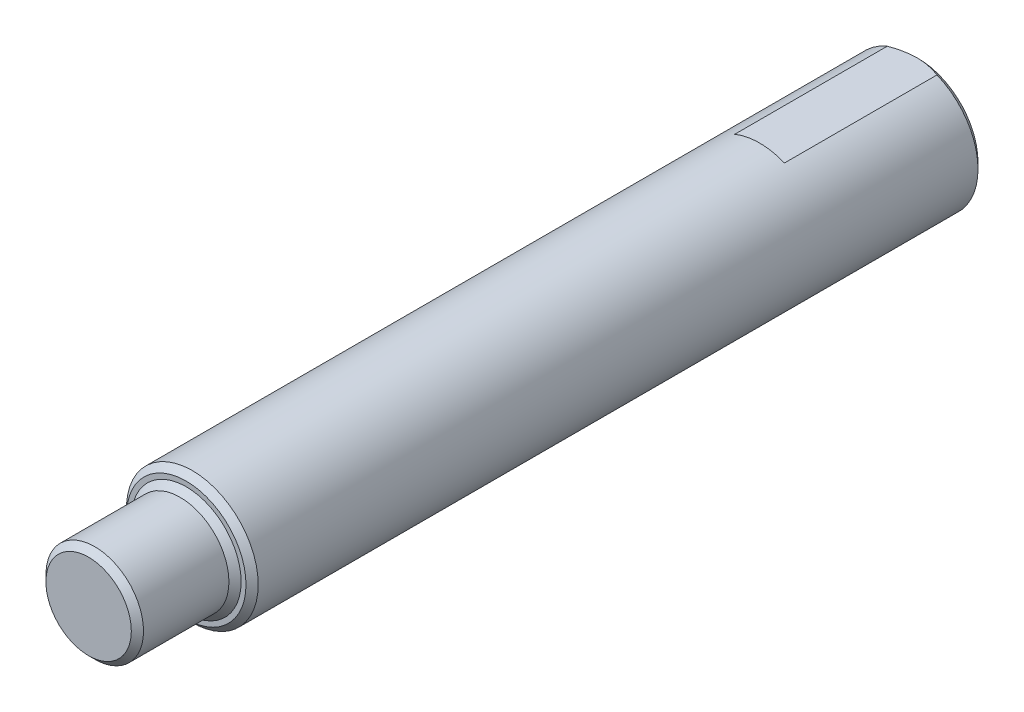
ISO-10303-21;
HEADER;
FILE_DESCRIPTION(('STEP AP214'),'2;1');
FILE_NAME('part.step','',(''),(''),'','','');
FILE_SCHEMA(('AUTOMOTIVE_DESIGN { 1 0 10303 214 1 1 1 1 }'));
ENDSEC;
DATA;
#1=APPLICATION_CONTEXT('core data for automotive mechanical design processes');
#2=APPLICATION_PROTOCOL_DEFINITION('international standard','automotive_design',2000,#1);
#3=PRODUCT_CONTEXT('',#1,'mechanical');
#4=PRODUCT('Part','Part','',(#3));
#5=PRODUCT_RELATED_PRODUCT_CATEGORY('part','',(#4));
#6=PRODUCT_DEFINITION_FORMATION('','',#4);
#7=PRODUCT_DEFINITION_CONTEXT('part definition',#1,'design');
#8=PRODUCT_DEFINITION('design','',#6,#7);
#9=PRODUCT_DEFINITION_SHAPE('','',#8);
#10=(LENGTH_UNIT() NAMED_UNIT(*) SI_UNIT(.MILLI.,.METRE.));
#11=(NAMED_UNIT(*) PLANE_ANGLE_UNIT() SI_UNIT($,.RADIAN.));
#12=(NAMED_UNIT(*) SI_UNIT($,.STERADIAN.) SOLID_ANGLE_UNIT());
#13=UNCERTAINTY_MEASURE_WITH_UNIT(LENGTH_MEASURE(1.E-05),#10,'distance_accuracy_value','');
#14=(GEOMETRIC_REPRESENTATION_CONTEXT(3) GLOBAL_UNCERTAINTY_ASSIGNED_CONTEXT((#13)) GLOBAL_UNIT_ASSIGNED_CONTEXT((#10,
#11,#12)) REPRESENTATION_CONTEXT('',''));
#15=CARTESIAN_POINT('',(0.,0.,0.));
#16=DIRECTION('',(0.,0.,1.));
#17=DIRECTION('',(1.,0.,0.));
#18=AXIS2_PLACEMENT_3D('',#15,#16,#17);
#19=CARTESIAN_POINT('',(0.,0.,60.));
#20=DIRECTION('',(0.,0.,-1.));
#21=DIRECTION('',(-1.,0.,0.));
#22=AXIS2_PLACEMENT_3D('',#19,#20,#21);
#23=CYLINDRICAL_SURFACE('',#22,5.4);
#24=CARTESIAN_POINT('',(0.,0.,59.5));
#25=DIRECTION('',(0.,0.,1.));
#26=DIRECTION('',(1.,0.,0.));
#27=AXIS2_PLACEMENT_3D('',#24,#25,#26);
#28=CIRCLE('',#27,5.4);
#29=CARTESIAN_POINT('',(5.4,0.,59.5));
#30=VERTEX_POINT('',#29);
#31=EDGE_CURVE('E110',#30,#30,#28,.F.);
#32=ORIENTED_EDGE('',*,*,#31,.T.);
#33=EDGE_LOOP('',(#32));
#34=FACE_BOUND('',#33,.T.);
#35=CARTESIAN_POINT('',(0.,0.,13.));
#36=DIRECTION('',(0.,0.,1.));
#37=DIRECTION('',(1.,0.,0.));
#38=AXIS2_PLACEMENT_3D('',#35,#36,#37);
#39=CIRCLE('',#38,5.4);
#40=CARTESIAN_POINT('',(-2.03960780543711,-5.,13.));
#41=VERTEX_POINT('',#40);
#42=CARTESIAN_POINT('',(2.03960780543711,-5.,13.));
#43=VERTEX_POINT('',#42);
#44=EDGE_CURVE('E85',#41,#43,#39,.T.);
#45=ORIENTED_EDGE('',*,*,#44,.T.);
#46=DIRECTION('',(0.,0.,-1.));
#47=VECTOR('',#46,1.);
#48=CARTESIAN_POINT('',(2.03960780543712,-5.,60.));
#49=LINE('',#48,#47);
#50=CARTESIAN_POINT('',(2.03960780543711,-5.,0.500000000000008));
#51=VERTEX_POINT('',#50);
#52=EDGE_CURVE('E91',#43,#51,#49,.T.);
#53=ORIENTED_EDGE('',*,*,#52,.T.);
#54=CARTESIAN_POINT('',(0.,0.,0.500000000000007));
#55=DIRECTION('',(0.,0.,1.));
#56=DIRECTION('',(1.,0.,0.));
#57=AXIS2_PLACEMENT_3D('',#54,#55,#56);
#58=CIRCLE('',#57,5.4);
#59=CARTESIAN_POINT('',(2.03960780543711,5.,0.500000000000007));
#60=VERTEX_POINT('',#59);
#61=EDGE_CURVE('E61',#51,#60,#58,.T.);
#62=ORIENTED_EDGE('',*,*,#61,.T.);
#63=DIRECTION('',(0.,0.,-1.));
#64=VECTOR('',#63,1.);
#65=CARTESIAN_POINT('',(2.03960780543712,5.,60.));
#66=LINE('',#65,#64);
#67=CARTESIAN_POINT('',(2.03960780543711,5.,13.));
#68=VERTEX_POINT('',#67);
#69=EDGE_CURVE('E105',#68,#60,#66,.T.);
#70=ORIENTED_EDGE('',*,*,#69,.F.);
#71=CARTESIAN_POINT('',(0.,0.,13.));
#72=DIRECTION('',(0.,0.,1.));
#73=DIRECTION('',(1.,0.,0.));
#74=AXIS2_PLACEMENT_3D('',#71,#72,#73);
#75=CIRCLE('',#74,5.4);
#76=CARTESIAN_POINT('',(-2.03960780543711,5.,13.));
#77=VERTEX_POINT('',#76);
#78=EDGE_CURVE('E141',#68,#77,#75,.T.);
#79=ORIENTED_EDGE('',*,*,#78,.T.);
#80=DIRECTION('',(0.,0.,-1.));
#81=VECTOR('',#80,1.);
#82=CARTESIAN_POINT('',(-2.03960780543712,5.,60.));
#83=LINE('',#82,#81);
#84=CARTESIAN_POINT('',(-2.03960780543711,5.,0.500000000000007));
#85=VERTEX_POINT('',#84);
#86=EDGE_CURVE('E103',#85,#77,#83,.F.);
#87=ORIENTED_EDGE('',*,*,#86,.F.);
#88=CARTESIAN_POINT('',(-2.03960780543711,-5.,0.500000000000007));
#89=VERTEX_POINT('',#88);
#90=EDGE_CURVE('E96',#85,#89,#58,.T.);
#91=ORIENTED_EDGE('',*,*,#90,.T.);
#92=DIRECTION('',(0.,0.,-1.));
#93=VECTOR('',#92,1.);
#94=CARTESIAN_POINT('',(-2.03960780543712,-5.,60.));
#95=LINE('',#94,#93);
#96=EDGE_CURVE('E53',#89,#41,#95,.F.);
#97=ORIENTED_EDGE('',*,*,#96,.T.);
#98=EDGE_LOOP('',(#45,#53,#62,#70,#79,#87,#91,#97));
#99=FACE_BOUND('',#98,.T.);
#100=ADVANCED_FACE('F38',(#34,#99),#23,.T.);
#101=CARTESIAN_POINT('',(0.,0.,0.500000000000007));
#102=DIRECTION('',(0.,0.,1.));
#103=DIRECTION('',(1.,0.,0.));
#104=AXIS2_PLACEMENT_3D('',#101,#102,#103);
#105=CONICAL_SURFACE('',#104,5.4,0.785398163397447);
#106=CARTESIAN_POINT('',(-3.55844793750581,-5.,1.23698229783495));
#107=CARTESIAN_POINT('',(-3.46862853281628,-5.,1.18490731578521));
#108=CARTESIAN_POINT('',(-3.37824708377921,-5.,1.13380360024076));
#109=CARTESIAN_POINT('',(-3.19623728614931,-5.,1.03381290104912));
#110=CARTESIAN_POINT('',(-3.1046086226093,-5.,0.984926491343647));
#111=CARTESIAN_POINT('',(-2.82702617390307,-5.,0.841677345323224));
#112=CARTESIAN_POINT('',(-2.63906658882332,-5.,0.751130536360764));
#113=CARTESIAN_POINT('',(-2.2542695508479,-5.,0.581916277053994));
#114=CARTESIAN_POINT('',(-2.05733888313538,-5.,0.50345845825728));
#115=CARTESIAN_POINT('',(-1.65751480131661,-5.,0.364256266708929));
#116=CARTESIAN_POINT('',(-1.45463196493869,-5.,0.303482344961025));
#117=CARTESIAN_POINT('',(-1.1246661128785,-5.,0.223502518929509));
#118=CARTESIAN_POINT('',(-0.999254136032922,-5.,0.197356244040858));
#119=CARTESIAN_POINT('',(-0.746871571155799,-5.,0.15394687361001));
#120=CARTESIAN_POINT('',(-0.619900907762319,-5.,0.136684209332924));
#121=CARTESIAN_POINT('',(-0.366074762066631,-5.,0.111805570168608));
#122=CARTESIAN_POINT('',(-0.239227094519322,-5.,0.10411060550821));
#123=CARTESIAN_POINT('',(0.0146882198085575,-5.,0.0984099621337345));
#124=CARTESIAN_POINT('',(0.141755871556909,-5.,0.100404505162544));
#125=CARTESIAN_POINT('',(0.414831894586562,-5.,0.115054400963583));
#126=CARTESIAN_POINT('',(0.560756443216524,-5.,0.129297800581306));
#127=CARTESIAN_POINT('',(0.850917867372853,-5.,0.169851883898828));
#128=CARTESIAN_POINT('',(0.995154397995766,-5.,0.196164991066867));
#129=CARTESIAN_POINT('',(1.28296336382971,-5.,0.260043725859942));
#130=CARTESIAN_POINT('',(1.42650538133624,-5.,0.297744851612287));
#131=CARTESIAN_POINT('',(1.71063388042909,-5.,0.382791524768694));
#132=CARTESIAN_POINT('',(1.85122096385267,-5.,0.43013508686298));
#133=CARTESIAN_POINT('',(2.17064155139045,-5.,0.548264489050553));
#134=CARTESIAN_POINT('',(2.34843963453476,-5.,0.621837222432526));
#135=CARTESIAN_POINT('',(2.6991696612,-5.,0.779875127886664));
#136=CARTESIAN_POINT('',(2.87209891120532,-5.,0.864346190248944));
#137=CARTESIAN_POINT('',(3.21409157523965,-5.,1.04213553536568));
#138=CARTESIAN_POINT('',(3.3831391222828,-5.,1.13548410277969));
#139=CARTESIAN_POINT('',(3.71726244007842,-5.,1.32892384637746));
#140=CARTESIAN_POINT('',(3.88233894061281,-5.,1.42901377061599));
#141=CARTESIAN_POINT('',(4.20141944792181,-5.,1.62972307247469));
#142=CARTESIAN_POINT('',(4.35557911866457,-5.,1.73009626769984));
#143=CARTESIAN_POINT('',(4.66125946164189,-5.,1.93479801264582));
#144=CARTESIAN_POINT('',(4.81277991763838,-5.,2.03912688426201));
#145=CARTESIAN_POINT('',(5.11224654466347,-5.,2.25009416663368));
#146=CARTESIAN_POINT('',(5.26021226580966,-5.,2.35670492382204));
#147=CARTESIAN_POINT('',(5.55416329412849,-5.,2.57254212643722));
#148=CARTESIAN_POINT('',(5.7001491331677,-5.,2.68176784668032));
#149=CARTESIAN_POINT('',(5.84531484286469,-5.,2.79205470678768));
#150=B_SPLINE_CURVE_WITH_KNOTS('',3,(#106,#107,#108,#109,#110,#111,#112,#113,#114,#115,#116,
#117,#118,#119,#120,#121,#122,#123,#124,#125,#126,#127,#128,#129,#130,#131,#132,#133,#134,#135,
#136,#137,#138,#139,#140,#141,#142,#143,#144,#145,#146,#147,#148,#149),.UNSPECIFIED.,.F.,.F.,(4,
2,2,2,2,2,2,2,2,2,2,2,2,2,2,2,2,2,2,2,2,4),(0.,0.31145870764884,0.622997580473991,
1.2484757186856,1.88380812576861,2.51807274309481,2.90212477400916,3.28619544741342,
3.66707375996794,4.04796078890492,4.48726123245068,4.92664992146675,5.37148755985959,
5.81623370173469,6.39300615892286,6.970091664264,7.54922173529119,8.12824455037746,
8.68004167511709,9.23188379943462,9.77896995199087,10.3259061044887),.UNSPECIFIED.);
#151=EDGE_CURVE('E88',#89,#51,#150,.T.);
#152=ORIENTED_EDGE('',*,*,#151,.F.);
#153=ORIENTED_EDGE('',*,*,#90,.F.);
#154=CARTESIAN_POINT('',(-3.55844793750581,5.,1.23698229783495));
#155=CARTESIAN_POINT('',(-3.46862853281628,5.,1.18490731578521));
#156=CARTESIAN_POINT('',(-3.37824708377921,5.,1.13380360024076));
#157=CARTESIAN_POINT('',(-3.19623728614931,5.,1.03381290104912));
#158=CARTESIAN_POINT('',(-3.1046086226093,5.,0.984926491343647));
#159=CARTESIAN_POINT('',(-2.82702617390307,5.,0.841677345323224));
#160=CARTESIAN_POINT('',(-2.63906658882332,5.,0.751130536360764));
#161=CARTESIAN_POINT('',(-2.2542695508479,5.,0.581916277053994));
#162=CARTESIAN_POINT('',(-2.05733888313538,5.,0.50345845825728));
#163=CARTESIAN_POINT('',(-1.65751480131661,5.,0.364256266708929));
#164=CARTESIAN_POINT('',(-1.45463196493869,5.,0.303482344961025));
#165=CARTESIAN_POINT('',(-1.1246661128785,5.,0.223502518929509));
#166=CARTESIAN_POINT('',(-0.999254136032922,5.,0.197356244040858));
#167=CARTESIAN_POINT('',(-0.746871571155799,5.,0.15394687361001));
#168=CARTESIAN_POINT('',(-0.619900907762319,5.,0.136684209332924));
#169=CARTESIAN_POINT('',(-0.366074762066631,5.,0.111805570168608));
#170=CARTESIAN_POINT('',(-0.239227094519322,5.,0.10411060550821));
#171=CARTESIAN_POINT('',(0.0146882198085575,5.,0.0984099621337345));
#172=CARTESIAN_POINT('',(0.141755871556909,5.,0.100404505162544));
#173=CARTESIAN_POINT('',(0.414831894586562,5.,0.115054400963583));
#174=CARTESIAN_POINT('',(0.560756443216524,5.,0.129297800581306));
#175=CARTESIAN_POINT('',(0.850917867372853,5.,0.169851883898828));
#176=CARTESIAN_POINT('',(0.995154397995766,5.,0.196164991066867));
#177=CARTESIAN_POINT('',(1.28296336382971,5.,0.260043725859942));
#178=CARTESIAN_POINT('',(1.42650538133624,5.,0.297744851612287));
#179=CARTESIAN_POINT('',(1.71063388042909,5.,0.382791524768694));
#180=CARTESIAN_POINT('',(1.85122096385267,5.,0.43013508686298));
#181=CARTESIAN_POINT('',(2.17064155139045,5.,0.548264489050553));
#182=CARTESIAN_POINT('',(2.34843963453476,5.,0.621837222432526));
#183=CARTESIAN_POINT('',(2.6991696612,5.,0.779875127886664));
#184=CARTESIAN_POINT('',(2.87209891120532,5.,0.864346190248944));
#185=CARTESIAN_POINT('',(3.21409157523965,5.,1.04213553536568));
#186=CARTESIAN_POINT('',(3.3831391222828,5.,1.13548410277969));
#187=CARTESIAN_POINT('',(3.71726244007842,5.,1.32892384637746));
#188=CARTESIAN_POINT('',(3.88233894061281,5.,1.42901377061599));
#189=CARTESIAN_POINT('',(4.20141944792181,5.,1.62972307247469));
#190=CARTESIAN_POINT('',(4.35557911866457,5.,1.73009626769984));
#191=CARTESIAN_POINT('',(4.66125946164189,5.,1.93479801264582));
#192=CARTESIAN_POINT('',(4.81277991763838,5.,2.03912688426201));
#193=CARTESIAN_POINT('',(5.11224654466347,5.,2.25009416663368));
#194=CARTESIAN_POINT('',(5.26021226580966,5.,2.35670492382204));
#195=CARTESIAN_POINT('',(5.55416329412849,5.,2.57254212643722));
#196=CARTESIAN_POINT('',(5.7001491331677,5.,2.68176784668032));
#197=CARTESIAN_POINT('',(5.84531484286469,5.,2.79205470678768));
#198=B_SPLINE_CURVE_WITH_KNOTS('',3,(#154,#155,#156,#157,#158,#159,#160,#161,#162,#163,#164,
#165,#166,#167,#168,#169,#170,#171,#172,#173,#174,#175,#176,#177,#178,#179,#180,#181,#182,#183,
#184,#185,#186,#187,#188,#189,#190,#191,#192,#193,#194,#195,#196,#197),.UNSPECIFIED.,.F.,.F.,(4,
2,2,2,2,2,2,2,2,2,2,2,2,2,2,2,2,2,2,2,2,4),(0.,0.31145870764884,0.622997580473991,
1.2484757186856,1.88380812576861,2.51807274309481,2.90212477400916,3.28619544741342,
3.66707375996794,4.04796078890492,4.48726123245068,4.92664992146675,5.37148755985959,
5.81623370173469,6.39300615892286,6.970091664264,7.54922173529119,8.12824455037746,
8.68004167511709,9.23188379943462,9.77896995199087,10.3259061044887),.UNSPECIFIED.);
#199=EDGE_CURVE('E132',#85,#60,#198,.T.);
#200=ORIENTED_EDGE('',*,*,#199,.T.);
#201=ORIENTED_EDGE('',*,*,#61,.F.);
#202=EDGE_LOOP('',(#152,#153,#200,#201));
#203=FACE_BOUND('',#202,.T.);
#204=CARTESIAN_POINT('',(0.,0.,0.));
#205=DIRECTION('',(0.,0.,1.));
#206=DIRECTION('',(1.,0.,0.));
#207=AXIS2_PLACEMENT_3D('',#204,#205,#206);
#208=CIRCLE('',#207,4.9);
#209=CARTESIAN_POINT('',(4.9,0.,0.));
#210=VERTEX_POINT('',#209);
#211=EDGE_CURVE('E114',#210,#210,#208,.F.);
#212=ORIENTED_EDGE('',*,*,#211,.F.);
#213=EDGE_LOOP('',(#212));
#214=FACE_BOUND('',#213,.T.);
#215=ADVANCED_FACE('F143',(#203,#214),#105,.T.);
#216=CARTESIAN_POINT('',(0.,0.,60.));
#217=DIRECTION('',(0.,0.,1.));
#218=DIRECTION('',(1.,0.,0.));
#219=AXIS2_PLACEMENT_3D('',#216,#217,#218);
#220=PLANE('',#219);
#221=CARTESIAN_POINT('',(0.,0.,60.));
#222=DIRECTION('',(0.,0.,1.));
#223=DIRECTION('',(1.,0.,0.));
#224=AXIS2_PLACEMENT_3D('',#221,#222,#223);
#225=CIRCLE('',#224,4.5);
#226=CARTESIAN_POINT('',(4.5,0.,60.));
#227=VERTEX_POINT('',#226);
#228=EDGE_CURVE('E11',#227,#227,#225,.F.);
#229=ORIENTED_EDGE('',*,*,#228,.T.);
#230=EDGE_LOOP('',(#229));
#231=FACE_BOUND('',#230,.T.);
#232=CARTESIAN_POINT('',(0.,0.,60.));
#233=DIRECTION('',(0.,0.,1.));
#234=DIRECTION('',(1.,0.,0.));
#235=AXIS2_PLACEMENT_3D('',#232,#233,#234);
#236=CIRCLE('',#235,4.90000000000002);
#237=CARTESIAN_POINT('',(4.90000000000002,0.,60.));
#238=VERTEX_POINT('',#237);
#239=EDGE_CURVE('E117',#238,#238,#236,.T.);
#240=ORIENTED_EDGE('',*,*,#239,.T.);
#241=EDGE_LOOP('',(#240));
#242=FACE_BOUND('',#241,.T.);
#243=ADVANCED_FACE('F174',(#231,#242),#220,.T.);
#244=CARTESIAN_POINT('',(0.,0.,0.));
#245=DIRECTION('',(0.,0.,1.));
#246=DIRECTION('',(1.,0.,0.));
#247=AXIS2_PLACEMENT_3D('',#244,#245,#246);
#248=PLANE('',#247);
#249=CARTESIAN_POINT('',(0.,0.,0.));
#250=DIRECTION('',(0.,0.,1.));
#251=DIRECTION('',(1.,0.,0.));
#252=AXIS2_PLACEMENT_3D('',#249,#250,#251);
#253=CIRCLE('',#252,2.6);
#254=CARTESIAN_POINT('',(2.6,0.,0.));
#255=VERTEX_POINT('',#254);
#256=EDGE_CURVE('E129',#255,#255,#253,.T.);
#257=ORIENTED_EDGE('',*,*,#256,.T.);
#258=EDGE_LOOP('',(#257));
#259=FACE_BOUND('',#258,.T.);
#260=ORIENTED_EDGE('',*,*,#211,.T.);
#261=EDGE_LOOP('',(#260));
#262=FACE_BOUND('',#261,.T.);
#263=ADVANCED_FACE('F177',(#259,#262),#248,.F.);
#264=CARTESIAN_POINT('',(0.,0.,60.));
#265=DIRECTION('',(0.,0.,-1.));
#266=DIRECTION('',(-1.,0.,0.));
#267=AXIS2_PLACEMENT_3D('',#264,#265,#266);
#268=CONICAL_SURFACE('',#267,4.90000000000002,0.785398163397447);
#269=ORIENTED_EDGE('',*,*,#31,.F.);
#270=EDGE_LOOP('',(#269));
#271=FACE_BOUND('',#270,.T.);
#272=ORIENTED_EDGE('',*,*,#239,.F.);
#273=EDGE_LOOP('',(#272));
#274=FACE_BOUND('',#273,.T.);
#275=ADVANCED_FACE('F172',(#271,#274),#268,.T.);
#276=CARTESIAN_POINT('',(0.,0.,68.));
#277=DIRECTION('',(0.,0.,-1.));
#278=DIRECTION('',(-1.,0.,0.));
#279=AXIS2_PLACEMENT_3D('',#276,#277,#278);
#280=CYLINDRICAL_SURFACE('',#279,4.);
#281=CARTESIAN_POINT('',(0.,0.,60.5));
#282=DIRECTION('',(0.,0.,1.));
#283=DIRECTION('',(1.,0.,0.));
#284=AXIS2_PLACEMENT_3D('',#281,#282,#283);
#285=CIRCLE('',#284,4.);
#286=CARTESIAN_POINT('',(4.,0.,60.5));
#287=VERTEX_POINT('',#286);
#288=EDGE_CURVE('E46',#287,#287,#285,.T.);
#289=ORIENTED_EDGE('',*,*,#288,.T.);
#290=EDGE_LOOP('',(#289));
#291=FACE_BOUND('',#290,.T.);
#292=CARTESIAN_POINT('',(0.,0.,67.5));
#293=DIRECTION('',(0.,0.,1.));
#294=DIRECTION('',(1.,0.,0.));
#295=AXIS2_PLACEMENT_3D('',#292,#293,#294);
#296=CIRCLE('',#295,4.);
#297=CARTESIAN_POINT('',(4.,0.,67.5));
#298=VERTEX_POINT('',#297);
#299=EDGE_CURVE('E123',#298,#298,#296,.F.);
#300=ORIENTED_EDGE('',*,*,#299,.T.);
#301=EDGE_LOOP('',(#300));
#302=FACE_BOUND('',#301,.T.);
#303=ADVANCED_FACE('F168',(#291,#302),#280,.T.);
#304=CARTESIAN_POINT('',(0.,0.,68.));
#305=DIRECTION('',(0.,0.,1.));
#306=DIRECTION('',(1.,0.,0.));
#307=AXIS2_PLACEMENT_3D('',#304,#305,#306);
#308=PLANE('',#307);
#309=CARTESIAN_POINT('',(0.,0.,68.));
#310=DIRECTION('',(0.,0.,1.));
#311=DIRECTION('',(1.,0.,0.));
#312=AXIS2_PLACEMENT_3D('',#309,#310,#311);
#313=CIRCLE('',#312,3.49999999999999);
#314=CARTESIAN_POINT('',(3.49999999999999,0.,68.));
#315=VERTEX_POINT('',#314);
#316=EDGE_CURVE('E120',#315,#315,#313,.T.);
#317=ORIENTED_EDGE('',*,*,#316,.T.);
#318=EDGE_LOOP('',(#317));
#319=FACE_BOUND('',#318,.T.);
#320=ADVANCED_FACE('F165',(#319),#308,.T.);
#321=CARTESIAN_POINT('',(0.,0.,68.));
#322=DIRECTION('',(0.,0.,-1.));
#323=DIRECTION('',(-1.,0.,0.));
#324=AXIS2_PLACEMENT_3D('',#321,#322,#323);
#325=CONICAL_SURFACE('',#324,3.49999999999999,0.785398163397445);
#326=ORIENTED_EDGE('',*,*,#299,.F.);
#327=EDGE_LOOP('',(#326));
#328=FACE_BOUND('',#327,.T.);
#329=ORIENTED_EDGE('',*,*,#316,.F.);
#330=EDGE_LOOP('',(#329));
#331=FACE_BOUND('',#330,.T.);
#332=ADVANCED_FACE('F163',(#328,#331),#325,.T.);
#333=CARTESIAN_POINT('',(0.,0.,12.4));
#334=DIRECTION('',(0.,0.,-1.));
#335=DIRECTION('',(-1.,0.,0.));
#336=AXIS2_PLACEMENT_3D('',#333,#334,#335);
#337=CONICAL_SURFACE('',#336,2.1,1.02974425867665);
#338=CARTESIAN_POINT('',(0.,0.,13.6618072999579));
#339=VERTEX_POINT('',#338);
#340=VERTEX_LOOP('',#339);
#341=FACE_BOUND('',#340,.T.);
#342=CARTESIAN_POINT('',(0.,0.,12.4));
#343=DIRECTION('',(0.,0.,-1.));
#344=DIRECTION('',(-1.,0.,0.));
#345=AXIS2_PLACEMENT_3D('',#342,#343,#344);
#346=CIRCLE('',#345,2.1);
#347=CARTESIAN_POINT('',(-2.1,0.,12.4));
#348=VERTEX_POINT('',#347);
#349=EDGE_CURVE('E107',#348,#348,#346,.T.);
#350=ORIENTED_EDGE('',*,*,#349,.T.);
#351=EDGE_LOOP('',(#350));
#352=FACE_BOUND('',#351,.T.);
#353=ADVANCED_FACE('F159',(#341,#352),#337,.F.);
#354=CARTESIAN_POINT('',(0.,0.,0.));
#355=DIRECTION('',(0.,0.,-1.));
#356=DIRECTION('',(-1.,0.,0.));
#357=AXIS2_PLACEMENT_3D('',#354,#355,#356);
#358=CYLINDRICAL_SURFACE('',#357,2.1);
#359=CARTESIAN_POINT('',(0.,0.,0.500000000000007));
#360=DIRECTION('',(0.,0.,1.));
#361=DIRECTION('',(1.,0.,0.));
#362=AXIS2_PLACEMENT_3D('',#359,#360,#361);
#363=CIRCLE('',#362,2.1);
#364=CARTESIAN_POINT('',(2.1,0.,0.500000000000007));
#365=VERTEX_POINT('',#364);
#366=EDGE_CURVE('E126',#365,#365,#363,.F.);
#367=ORIENTED_EDGE('',*,*,#366,.T.);
#368=EDGE_LOOP('',(#367));
#369=FACE_BOUND('',#368,.T.);
#370=ORIENTED_EDGE('',*,*,#349,.F.);
#371=EDGE_LOOP('',(#370));
#372=FACE_BOUND('',#371,.T.);
#373=ADVANCED_FACE('F155',(#369,#372),#358,.F.);
#374=CARTESIAN_POINT('',(0.,0.,0.500000000000007));
#375=DIRECTION('',(0.,0.,-1.));
#376=DIRECTION('',(-1.,0.,0.));
#377=AXIS2_PLACEMENT_3D('',#374,#375,#376);
#378=CONICAL_SURFACE('',#377,2.1,0.785398163397441);
#379=ORIENTED_EDGE('',*,*,#256,.F.);
#380=EDGE_LOOP('',(#379));
#381=FACE_BOUND('',#380,.T.);
#382=ORIENTED_EDGE('',*,*,#366,.F.);
#383=EDGE_LOOP('',(#382));
#384=FACE_BOUND('',#383,.T.);
#385=ADVANCED_FACE('F158',(#381,#384),#378,.F.);
#386=CARTESIAN_POINT('',(-5.,5.,13.));
#387=DIRECTION('',(0.,0.,1.));
#388=DIRECTION('',(1.,0.,0.));
#389=AXIS2_PLACEMENT_3D('',#386,#387,#388);
#390=PLANE('',#389);
#391=DIRECTION('',(1.,0.,0.));
#392=VECTOR('',#391,1.);
#393=CARTESIAN_POINT('',(-5.,5.,13.));
#394=LINE('',#393,#392);
#395=EDGE_CURVE('E98',#77,#68,#394,.T.);
#396=ORIENTED_EDGE('',*,*,#395,.F.);
#397=ORIENTED_EDGE('',*,*,#78,.F.);
#398=EDGE_LOOP('',(#396,#397));
#399=FACE_BOUND('',#398,.T.);
#400=ADVANCED_FACE('F152',(#399),#390,.F.);
#401=CARTESIAN_POINT('',(-5.,5.,13.));
#402=DIRECTION('',(0.,1.,0.));
#403=DIRECTION('',(0.,0.,1.));
#404=AXIS2_PLACEMENT_3D('',#401,#402,#403);
#405=PLANE('',#404);
#406=ORIENTED_EDGE('',*,*,#69,.T.);
#407=ORIENTED_EDGE('',*,*,#199,.F.);
#408=ORIENTED_EDGE('',*,*,#86,.T.);
#409=ORIENTED_EDGE('',*,*,#395,.T.);
#410=EDGE_LOOP('',(#406,#407,#408,#409));
#411=FACE_BOUND('',#410,.T.);
#412=ADVANCED_FACE('F147',(#411),#405,.T.);
#413=CARTESIAN_POINT('',(-5.,-5.,13.));
#414=DIRECTION('',(0.,0.,1.));
#415=DIRECTION('',(1.,0.,0.));
#416=AXIS2_PLACEMENT_3D('',#413,#414,#415);
#417=PLANE('',#416);
#418=DIRECTION('',(1.,0.,0.));
#419=VECTOR('',#418,1.);
#420=CARTESIAN_POINT('',(-5.,-5.,13.));
#421=LINE('',#420,#419);
#422=EDGE_CURVE('E87',#41,#43,#421,.T.);
#423=ORIENTED_EDGE('',*,*,#422,.T.);
#424=ORIENTED_EDGE('',*,*,#44,.F.);
#425=EDGE_LOOP('',(#423,#424));
#426=FACE_BOUND('',#425,.T.);
#427=ADVANCED_FACE('F86',(#426),#417,.F.);
#428=CARTESIAN_POINT('',(-5.,-5.,13.));
#429=DIRECTION('',(0.,1.,0.));
#430=DIRECTION('',(0.,0.,1.));
#431=AXIS2_PLACEMENT_3D('',#428,#429,#430);
#432=PLANE('',#431);
#433=ORIENTED_EDGE('',*,*,#422,.F.);
#434=ORIENTED_EDGE('',*,*,#96,.F.);
#435=ORIENTED_EDGE('',*,*,#151,.T.);
#436=ORIENTED_EDGE('',*,*,#52,.F.);
#437=EDGE_LOOP('',(#433,#434,#435,#436));
#438=FACE_BOUND('',#437,.T.);
#439=ADVANCED_FACE('F90',(#438),#432,.F.);
#440=CARTESIAN_POINT('',(0.,0.,60.5));
#441=DIRECTION('',(0.,0.,-1.));
#442=DIRECTION('',(-1.,0.,0.));
#443=AXIS2_PLACEMENT_3D('',#440,#441,#442);
#444=CONICAL_SURFACE('',#443,4.,0.785398163397452);
#445=ORIENTED_EDGE('',*,*,#228,.F.);
#446=EDGE_LOOP('',(#445));
#447=FACE_BOUND('',#446,.T.);
#448=ORIENTED_EDGE('',*,*,#288,.F.);
#449=EDGE_LOOP('',(#448));
#450=FACE_BOUND('',#449,.T.);
#451=ADVANCED_FACE('F40',(#447,#450),#444,.T.);
#452=CLOSED_SHELL('',(#100,#215,#243,#263,#275,#303,#320,#332,#353,#373,#385,#400,#412,#427,
#439,#451));
#453=MANIFOLD_SOLID_BREP('B2',#452);
#454=ADVANCED_BREP_SHAPE_REPRESENTATION('',(#18,#453),#14);
#455=SHAPE_DEFINITION_REPRESENTATION(#9,#454);
ENDSEC;
END-ISO-10303-21;
